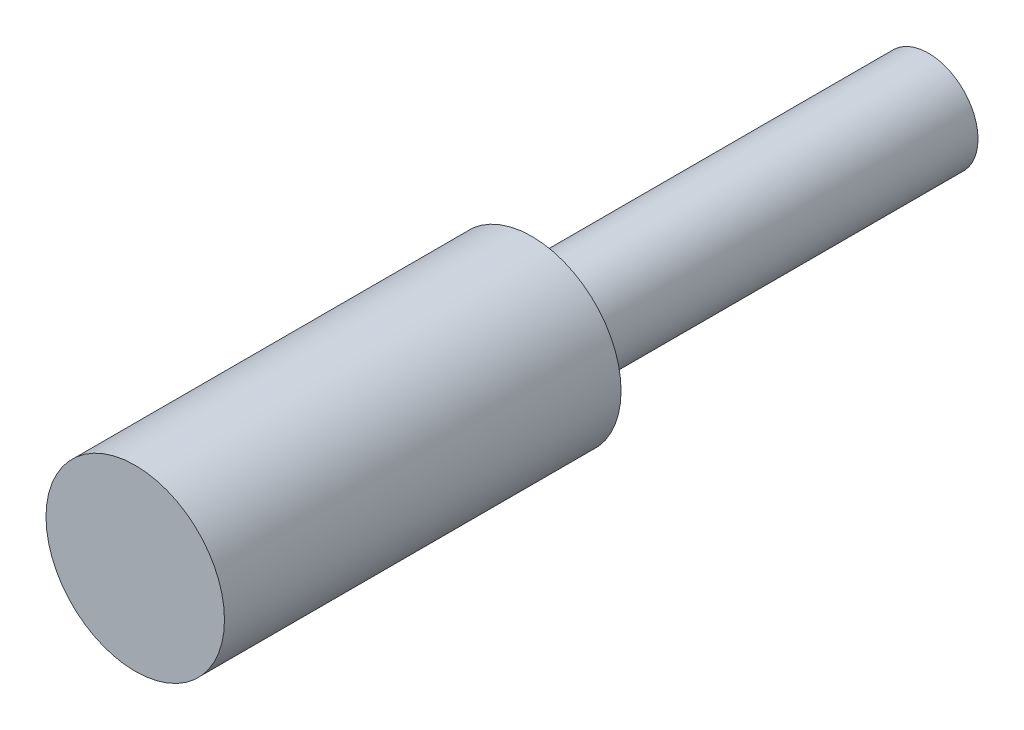
ISO-10303-21;
HEADER;
FILE_DESCRIPTION(('STEP AP214'),'2;1');
FILE_NAME('part.step','',(''),(''),'','','');
FILE_SCHEMA(('AUTOMOTIVE_DESIGN { 1 0 10303 214 1 1 1 1 }'));
ENDSEC;
DATA;
#1=APPLICATION_CONTEXT('core data for automotive mechanical design processes');
#2=APPLICATION_PROTOCOL_DEFINITION('international standard','automotive_design',2000,#1);
#3=PRODUCT_CONTEXT('',#1,'mechanical');
#4=PRODUCT('Part','Part','',(#3));
#5=PRODUCT_RELATED_PRODUCT_CATEGORY('part','',(#4));
#6=PRODUCT_DEFINITION_FORMATION('','',#4);
#7=PRODUCT_DEFINITION_CONTEXT('part definition',#1,'design');
#8=PRODUCT_DEFINITION('design','',#6,#7);
#9=PRODUCT_DEFINITION_SHAPE('','',#8);
#10=(LENGTH_UNIT() NAMED_UNIT(*) SI_UNIT(.MILLI.,.METRE.));
#11=(NAMED_UNIT(*) PLANE_ANGLE_UNIT() SI_UNIT($,.RADIAN.));
#12=(NAMED_UNIT(*) SI_UNIT($,.STERADIAN.) SOLID_ANGLE_UNIT());
#13=UNCERTAINTY_MEASURE_WITH_UNIT(LENGTH_MEASURE(1.E-05),#10,'distance_accuracy_value','');
#14=(GEOMETRIC_REPRESENTATION_CONTEXT(3) GLOBAL_UNCERTAINTY_ASSIGNED_CONTEXT((#13)) GLOBAL_UNIT_ASSIGNED_CONTEXT((#10,
#11,#12)) REPRESENTATION_CONTEXT('',''));
#15=CARTESIAN_POINT('',(0.,0.,0.));
#16=DIRECTION('',(0.,0.,1.));
#17=DIRECTION('',(1.,0.,0.));
#18=AXIS2_PLACEMENT_3D('',#15,#16,#17);
#19=CARTESIAN_POINT('',(0.,0.,20.));
#20=DIRECTION('',(0.,0.,-1.));
#21=DIRECTION('',(-1.,0.,0.));
#22=AXIS2_PLACEMENT_3D('',#19,#20,#21);
#23=CYLINDRICAL_SURFACE('',#22,2.5);
#24=CARTESIAN_POINT('',(0.,0.,20.));
#25=DIRECTION('',(0.,0.,1.));
#26=DIRECTION('',(1.,0.,0.));
#27=AXIS2_PLACEMENT_3D('',#24,#25,#26);
#28=CIRCLE('',#27,2.5);
#29=CARTESIAN_POINT('',(2.5,0.,20.));
#30=VERTEX_POINT('',#29);
#31=EDGE_CURVE('E10',#30,#30,#28,.T.);
#32=ORIENTED_EDGE('',*,*,#31,.F.);
#33=EDGE_LOOP('',(#32));
#34=FACE_BOUND('',#33,.T.);
#35=CARTESIAN_POINT('',(0.,0.,0.));
#36=DIRECTION('',(0.,0.,1.));
#37=DIRECTION('',(1.,0.,0.));
#38=AXIS2_PLACEMENT_3D('',#35,#36,#37);
#39=CIRCLE('',#38,2.5);
#40=CARTESIAN_POINT('',(2.5,0.,0.));
#41=VERTEX_POINT('',#40);
#42=EDGE_CURVE('E39',#41,#41,#39,.T.);
#43=ORIENTED_EDGE('',*,*,#42,.T.);
#44=EDGE_LOOP('',(#43));
#45=FACE_BOUND('',#44,.T.);
#46=ADVANCED_FACE('F36',(#34,#45),#23,.T.);
#47=CARTESIAN_POINT('',(0.,0.,0.));
#48=DIRECTION('',(0.,0.,1.));
#49=DIRECTION('',(1.,0.,0.));
#50=AXIS2_PLACEMENT_3D('',#47,#48,#49);
#51=PLANE('',#50);
#52=ORIENTED_EDGE('',*,*,#42,.F.);
#53=EDGE_LOOP('',(#52));
#54=FACE_BOUND('',#53,.T.);
#55=ADVANCED_FACE('F59',(#54),#51,.F.);
#56=CARTESIAN_POINT('',(0.,0.,40.));
#57=DIRECTION('',(0.,0.,-1.));
#58=DIRECTION('',(-1.,0.,0.));
#59=AXIS2_PLACEMENT_3D('',#56,#57,#58);
#60=CYLINDRICAL_SURFACE('',#59,4.5);
#61=CARTESIAN_POINT('',(0.,0.,40.));
#62=DIRECTION('',(0.,0.,1.));
#63=DIRECTION('',(1.,0.,0.));
#64=AXIS2_PLACEMENT_3D('',#61,#62,#63);
#65=CIRCLE('',#64,4.5);
#66=CARTESIAN_POINT('',(4.5,0.,40.));
#67=VERTEX_POINT('',#66);
#68=EDGE_CURVE('E46',#67,#67,#65,.T.);
#69=ORIENTED_EDGE('',*,*,#68,.F.);
#70=EDGE_LOOP('',(#69));
#71=FACE_BOUND('',#70,.T.);
#72=CARTESIAN_POINT('',(0.,0.,20.));
#73=DIRECTION('',(0.,0.,1.));
#74=DIRECTION('',(1.,0.,0.));
#75=AXIS2_PLACEMENT_3D('',#72,#73,#74);
#76=CIRCLE('',#75,4.5);
#77=CARTESIAN_POINT('',(4.5,0.,20.));
#78=VERTEX_POINT('',#77);
#79=EDGE_CURVE('E48',#78,#78,#76,.T.);
#80=ORIENTED_EDGE('',*,*,#79,.T.);
#81=EDGE_LOOP('',(#80));
#82=FACE_BOUND('',#81,.T.);
#83=ADVANCED_FACE('F56',(#71,#82),#60,.T.);
#84=CARTESIAN_POINT('',(0.,0.,40.));
#85=DIRECTION('',(0.,0.,1.));
#86=DIRECTION('',(1.,0.,0.));
#87=AXIS2_PLACEMENT_3D('',#84,#85,#86);
#88=PLANE('',#87);
#89=ORIENTED_EDGE('',*,*,#68,.T.);
#90=EDGE_LOOP('',(#89));
#91=FACE_BOUND('',#90,.T.);
#92=ADVANCED_FACE('F54',(#91),#88,.T.);
#93=CARTESIAN_POINT('',(0.,0.,20.));
#94=DIRECTION('',(0.,0.,1.));
#95=DIRECTION('',(1.,0.,0.));
#96=AXIS2_PLACEMENT_3D('',#93,#94,#95);
#97=PLANE('',#96);
#98=ORIENTED_EDGE('',*,*,#31,.T.);
#99=EDGE_LOOP('',(#98));
#100=FACE_BOUND('',#99,.T.);
#101=ORIENTED_EDGE('',*,*,#79,.F.);
#102=EDGE_LOOP('',(#101));
#103=FACE_BOUND('',#102,.T.);
#104=ADVANCED_FACE('F63',(#100,#103),#97,.F.);
#105=CLOSED_SHELL('',(#46,#55,#83,#92,#104));
#106=MANIFOLD_SOLID_BREP('B2',#105);
#107=ADVANCED_BREP_SHAPE_REPRESENTATION('',(#18,#106),#14);
#108=SHAPE_DEFINITION_REPRESENTATION(#9,#107);
ENDSEC;
END-ISO-10303-21;
